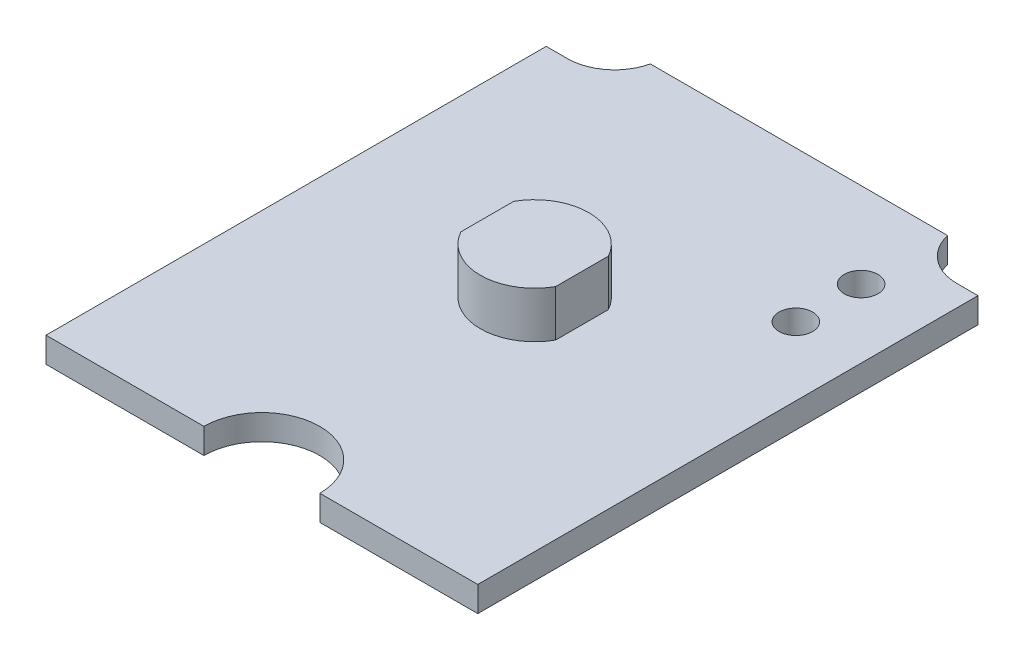
ISO-10303-21;
HEADER;
FILE_DESCRIPTION(('STEP AP214'),'2;1');
FILE_NAME('part.step','',(''),(''),'','','');
FILE_SCHEMA(('AUTOMOTIVE_DESIGN { 1 0 10303 214 1 1 1 1 }'));
ENDSEC;
DATA;
#1=APPLICATION_CONTEXT('core data for automotive mechanical design processes');
#2=APPLICATION_PROTOCOL_DEFINITION('international standard','automotive_design',2000,#1);
#3=PRODUCT_CONTEXT('',#1,'mechanical');
#4=PRODUCT('Part','Part','',(#3));
#5=PRODUCT_RELATED_PRODUCT_CATEGORY('part','',(#4));
#6=PRODUCT_DEFINITION_FORMATION('','',#4);
#7=PRODUCT_DEFINITION_CONTEXT('part definition',#1,'design');
#8=PRODUCT_DEFINITION('design','',#6,#7);
#9=PRODUCT_DEFINITION_SHAPE('','',#8);
#10=(LENGTH_UNIT() NAMED_UNIT(*) SI_UNIT(.MILLI.,.METRE.));
#11=(NAMED_UNIT(*) PLANE_ANGLE_UNIT() SI_UNIT($,.RADIAN.));
#12=(NAMED_UNIT(*) SI_UNIT($,.STERADIAN.) SOLID_ANGLE_UNIT());
#13=UNCERTAINTY_MEASURE_WITH_UNIT(LENGTH_MEASURE(1.E-05),#10,'distance_accuracy_value','');
#14=(GEOMETRIC_REPRESENTATION_CONTEXT(3) GLOBAL_UNCERTAINTY_ASSIGNED_CONTEXT((#13)) GLOBAL_UNIT_ASSIGNED_CONTEXT((#10,
#11,#12)) REPRESENTATION_CONTEXT('',''));
#15=CARTESIAN_POINT('',(0.,0.,0.));
#16=DIRECTION('',(0.,0.,1.));
#17=DIRECTION('',(1.,0.,0.));
#18=AXIS2_PLACEMENT_3D('',#15,#16,#17);
#19=CARTESIAN_POINT('',(0.,2.2,0.));
#20=DIRECTION('',(0.,1.,0.));
#21=DIRECTION('',(0.,0.,1.));
#22=AXIS2_PLACEMENT_3D('',#19,#20,#21);
#23=PLANE('',#22);
#24=CARTESIAN_POINT('',(0.,2.2,0.));
#25=DIRECTION('',(0.,1.,0.));
#26=DIRECTION('',(0.,0.,1.));
#27=AXIS2_PLACEMENT_3D('',#24,#25,#26);
#28=CIRCLE('',#27,2.575);
#29=CARTESIAN_POINT('',(2.25,2.2,1.25224797863686));
#30=VERTEX_POINT('',#29);
#31=CARTESIAN_POINT('',(-2.24999999999998,2.2,1.25224797863685));
#32=VERTEX_POINT('',#31);
#33=EDGE_CURVE('E139',#30,#32,#28,.F.);
#34=ORIENTED_EDGE('',*,*,#33,.F.);
#35=DIRECTION('',(0.,0.,-1.));
#36=VECTOR('',#35,1.);
#37=CARTESIAN_POINT('',(2.25,2.2,1.252247978637));
#38=LINE('',#37,#36);
#39=CARTESIAN_POINT('',(2.24999999999998,2.2,-1.25224797863685));
#40=VERTEX_POINT('',#39);
#41=EDGE_CURVE('E136',#40,#30,#38,.F.);
#42=ORIENTED_EDGE('',*,*,#41,.F.);
#43=CARTESIAN_POINT('',(0.,2.2,0.));
#44=DIRECTION('',(0.,1.,0.));
#45=DIRECTION('',(0.,0.,1.));
#46=AXIS2_PLACEMENT_3D('',#43,#44,#45);
#47=CIRCLE('',#46,2.575);
#48=CARTESIAN_POINT('',(-2.25,2.2,-1.25224797863686));
#49=VERTEX_POINT('',#48);
#50=EDGE_CURVE('E19',#49,#40,#47,.F.);
#51=ORIENTED_EDGE('',*,*,#50,.F.);
#52=DIRECTION('',(0.,0.,1.));
#53=VECTOR('',#52,1.);
#54=CARTESIAN_POINT('',(-2.25,2.2,-1.252247978637));
#55=LINE('',#54,#53);
#56=EDGE_CURVE('E141',#32,#49,#55,.F.);
#57=ORIENTED_EDGE('',*,*,#56,.F.);
#58=EDGE_LOOP('',(#34,#42,#51,#57));
#59=FACE_BOUND('',#58,.T.);
#60=ADVANCED_FACE('F16',(#59),#23,.T.);
#61=CARTESIAN_POINT('',(0.,-3.2,0.));
#62=DIRECTION('',(0.,-1.,0.));
#63=DIRECTION('',(0.,0.,-1.));
#64=AXIS2_PLACEMENT_3D('',#61,#62,#63);
#65=PLANE('',#64);
#66=DIRECTION('',(1.,0.,0.));
#67=VECTOR('',#66,1.);
#68=CARTESIAN_POINT('',(-3.,-3.2,5.5));
#69=LINE('',#68,#67);
#70=CARTESIAN_POINT('',(-9.,-3.2,5.5));
#71=VERTEX_POINT('',#70);
#72=CARTESIAN_POINT('',(-3.,-3.2,5.5));
#73=VERTEX_POINT('',#72);
#74=EDGE_CURVE('E260',#71,#73,#69,.T.);
#75=ORIENTED_EDGE('',*,*,#74,.F.);
#76=DIRECTION('',(0.,0.,1.));
#77=VECTOR('',#76,1.);
#78=CARTESIAN_POINT('',(-9.,-3.2,5.5));
#79=LINE('',#78,#77);
#80=CARTESIAN_POINT('',(-9.,-3.2,-3.2));
#81=VERTEX_POINT('',#80);
#82=EDGE_CURVE('E234',#81,#71,#79,.T.);
#83=ORIENTED_EDGE('',*,*,#82,.F.);
#84=DIRECTION('',(-1.,0.,0.));
#85=VECTOR('',#84,1.);
#86=CARTESIAN_POINT('',(-9.,-3.2,-3.2));
#87=LINE('',#86,#85);
#88=CARTESIAN_POINT('',(-3.,-3.2,-3.2));
#89=VERTEX_POINT('',#88);
#90=EDGE_CURVE('E250',#89,#81,#87,.T.);
#91=ORIENTED_EDGE('',*,*,#90,.F.);
#92=DIRECTION('',(0.,0.,-1.));
#93=VECTOR('',#92,1.);
#94=CARTESIAN_POINT('',(-3.,-3.2,-3.2));
#95=LINE('',#94,#93);
#96=EDGE_CURVE('E255',#73,#89,#95,.T.);
#97=ORIENTED_EDGE('',*,*,#96,.F.);
#98=EDGE_LOOP('',(#75,#83,#91,#97));
#99=FACE_BOUND('',#98,.T.);
#100=ADVANCED_FACE('F485',(#99),#65,.T.);
#101=CARTESIAN_POINT('',(0.,-4.5,0.));
#102=DIRECTION('',(0.,1.,0.));
#103=DIRECTION('',(0.,0.,1.));
#104=AXIS2_PLACEMENT_3D('',#101,#102,#103);
#105=PLANE('',#104);
#106=CARTESIAN_POINT('',(0.,-4.5,1.75));
#107=DIRECTION('',(0.,1.,0.));
#108=DIRECTION('',(0.,0.,1.));
#109=AXIS2_PLACEMENT_3D('',#106,#107,#108);
#110=CIRCLE('',#109,0.25);
#111=CARTESIAN_POINT('',(0.,-4.5,2.));
#112=VERTEX_POINT('',#111);
#113=EDGE_CURVE('E232',#112,#112,#110,.T.);
#114=ORIENTED_EDGE('',*,*,#113,.F.);
#115=EDGE_LOOP('',(#114));
#116=FACE_BOUND('',#115,.T.);
#117=ADVANCED_FACE('F482',(#116),#105,.F.);
#118=CARTESIAN_POINT('',(0.,-4.5,0.));
#119=DIRECTION('',(0.,1.,0.));
#120=DIRECTION('',(0.,0.,1.));
#121=AXIS2_PLACEMENT_3D('',#118,#119,#120);
#122=PLANE('',#121);
#123=CARTESIAN_POINT('',(0.,-4.5,-1.75));
#124=DIRECTION('',(0.,1.,0.));
#125=DIRECTION('',(0.,0.,1.));
#126=AXIS2_PLACEMENT_3D('',#123,#124,#125);
#127=CIRCLE('',#126,0.25);
#128=CARTESIAN_POINT('',(0.,-4.5,-1.5));
#129=VERTEX_POINT('',#128);
#130=EDGE_CURVE('E229',#129,#129,#127,.T.);
#131=ORIENTED_EDGE('',*,*,#130,.F.);
#132=EDGE_LOOP('',(#131));
#133=FACE_BOUND('',#132,.T.);
#134=ADVANCED_FACE('F479',(#133),#122,.F.);
#135=CARTESIAN_POINT('',(2.25,0.,1.252247978637));
#136=DIRECTION('',(1.,0.,0.));
#137=DIRECTION('',(0.,0.,-1.));
#138=AXIS2_PLACEMENT_3D('',#135,#136,#137);
#139=PLANE('',#138);
#140=DIRECTION('',(0.,1.,0.));
#141=VECTOR('',#140,1.);
#142=CARTESIAN_POINT('',(2.24999999999996,0.,-1.25224797863689));
#143=LINE('',#142,#141);
#144=CARTESIAN_POINT('',(2.24999999999998,0.,-1.25224797863685));
#145=VERTEX_POINT('',#144);
#146=EDGE_CURVE('E153',#40,#145,#143,.F.);
#147=ORIENTED_EDGE('',*,*,#146,.F.);
#148=ORIENTED_EDGE('',*,*,#41,.T.);
#149=DIRECTION('',(0.,1.,0.));
#150=VECTOR('',#149,1.);
#151=CARTESIAN_POINT('',(2.25,0.,1.25224797863691));
#152=LINE('',#151,#150);
#153=CARTESIAN_POINT('',(2.25,0.,1.25224797863686));
#154=VERTEX_POINT('',#153);
#155=EDGE_CURVE('E151',#30,#154,#152,.F.);
#156=ORIENTED_EDGE('',*,*,#155,.T.);
#157=DIRECTION('',(0.,0.,1.));
#158=VECTOR('',#157,1.);
#159=CARTESIAN_POINT('',(2.25,0.,0.));
#160=LINE('',#159,#158);
#161=EDGE_CURVE('E228',#154,#145,#160,.F.);
#162=ORIENTED_EDGE('',*,*,#161,.T.);
#163=EDGE_LOOP('',(#147,#148,#156,#162));
#164=FACE_BOUND('',#163,.T.);
#165=ADVANCED_FACE('F149',(#164),#139,.T.);
#166=CARTESIAN_POINT('',(0.,0.,0.));
#167=DIRECTION('',(0.,1.,0.));
#168=DIRECTION('',(0.,0.,1.));
#169=AXIS2_PLACEMENT_3D('',#166,#167,#168);
#170=CYLINDRICAL_SURFACE('',#169,2.575);
#171=DIRECTION('',(0.,1.,0.));
#172=VECTOR('',#171,1.);
#173=CARTESIAN_POINT('',(-2.25,0.,-1.25224797863691));
#174=LINE('',#173,#172);
#175=CARTESIAN_POINT('',(-2.25,0.,-1.25224797863686));
#176=VERTEX_POINT('',#175);
#177=EDGE_CURVE('E162',#49,#176,#174,.F.);
#178=ORIENTED_EDGE('',*,*,#177,.F.);
#179=ORIENTED_EDGE('',*,*,#50,.T.);
#180=ORIENTED_EDGE('',*,*,#146,.T.);
#181=CARTESIAN_POINT('',(0.,0.,0.));
#182=DIRECTION('',(0.,1.,0.));
#183=DIRECTION('',(0.,0.,1.));
#184=AXIS2_PLACEMENT_3D('',#181,#182,#183);
#185=CIRCLE('',#184,2.575);
#186=EDGE_CURVE('E225',#145,#176,#185,.T.);
#187=ORIENTED_EDGE('',*,*,#186,.T.);
#188=EDGE_LOOP('',(#178,#179,#180,#187));
#189=FACE_BOUND('',#188,.T.);
#190=ADVANCED_FACE('F268',(#189),#170,.T.);
#191=CARTESIAN_POINT('',(-2.25,0.,-1.252247978637));
#192=DIRECTION('',(-1.,0.,0.));
#193=DIRECTION('',(0.,0.,1.));
#194=AXIS2_PLACEMENT_3D('',#191,#192,#193);
#195=PLANE('',#194);
#196=DIRECTION('',(0.,1.,0.));
#197=VECTOR('',#196,1.);
#198=CARTESIAN_POINT('',(-2.24999999999996,0.,1.25224797863689));
#199=LINE('',#198,#197);
#200=CARTESIAN_POINT('',(-2.24999999999998,0.,1.25224797863685));
#201=VERTEX_POINT('',#200);
#202=EDGE_CURVE('E145',#32,#201,#199,.F.);
#203=ORIENTED_EDGE('',*,*,#202,.F.);
#204=ORIENTED_EDGE('',*,*,#56,.T.);
#205=ORIENTED_EDGE('',*,*,#177,.T.);
#206=DIRECTION('',(0.,0.,1.));
#207=VECTOR('',#206,1.);
#208=CARTESIAN_POINT('',(-2.25,0.,0.));
#209=LINE('',#208,#207);
#210=EDGE_CURVE('E224',#176,#201,#209,.T.);
#211=ORIENTED_EDGE('',*,*,#210,.T.);
#212=EDGE_LOOP('',(#203,#204,#205,#211));
#213=FACE_BOUND('',#212,.T.);
#214=ADVANCED_FACE('F472',(#213),#195,.T.);
#215=CARTESIAN_POINT('',(0.,0.,0.));
#216=DIRECTION('',(0.,1.,0.));
#217=DIRECTION('',(0.,0.,1.));
#218=AXIS2_PLACEMENT_3D('',#215,#216,#217);
#219=CYLINDRICAL_SURFACE('',#218,2.575);
#220=ORIENTED_EDGE('',*,*,#33,.T.);
#221=ORIENTED_EDGE('',*,*,#202,.T.);
#222=CARTESIAN_POINT('',(0.,0.,0.));
#223=DIRECTION('',(0.,1.,0.));
#224=DIRECTION('',(0.,0.,1.));
#225=AXIS2_PLACEMENT_3D('',#222,#223,#224);
#226=CIRCLE('',#225,2.575);
#227=EDGE_CURVE('E157',#201,#154,#226,.T.);
#228=ORIENTED_EDGE('',*,*,#227,.T.);
#229=ORIENTED_EDGE('',*,*,#155,.F.);
#230=EDGE_LOOP('',(#220,#221,#228,#229));
#231=FACE_BOUND('',#230,.T.);
#232=ADVANCED_FACE('F155',(#231),#219,.T.);
#233=CARTESIAN_POINT('',(-3.,-1.4,5.5));
#234=DIRECTION('',(0.,0.,1.));
#235=DIRECTION('',(1.,0.,0.));
#236=AXIS2_PLACEMENT_3D('',#233,#234,#235);
#237=PLANE('',#236);
#238=DIRECTION('',(0.,1.,0.));
#239=VECTOR('',#238,1.);
#240=CARTESIAN_POINT('',(-9.,-1.4,5.5));
#241=LINE('',#240,#239);
#242=CARTESIAN_POINT('',(-9.,-1.4,5.5));
#243=VERTEX_POINT('',#242);
#244=EDGE_CURVE('E244',#71,#243,#241,.T.);
#245=ORIENTED_EDGE('',*,*,#244,.F.);
#246=ORIENTED_EDGE('',*,*,#74,.T.);
#247=DIRECTION('',(0.,1.,0.));
#248=VECTOR('',#247,1.);
#249=CARTESIAN_POINT('',(-3.,-1.4,5.5));
#250=LINE('',#249,#248);
#251=CARTESIAN_POINT('',(-3.,-1.4,5.5));
#252=VERTEX_POINT('',#251);
#253=EDGE_CURVE('E257',#252,#73,#250,.F.);
#254=ORIENTED_EDGE('',*,*,#253,.F.);
#255=DIRECTION('',(1.,0.,0.));
#256=VECTOR('',#255,1.);
#257=CARTESIAN_POINT('',(0.,-1.4,5.5));
#258=LINE('',#257,#256);
#259=EDGE_CURVE('E223',#243,#252,#258,.T.);
#260=ORIENTED_EDGE('',*,*,#259,.F.);
#261=EDGE_LOOP('',(#245,#246,#254,#260));
#262=FACE_BOUND('',#261,.T.);
#263=ADVANCED_FACE('F465',(#262),#237,.T.);
#264=CARTESIAN_POINT('',(-3.,-1.4,-3.2));
#265=DIRECTION('',(1.,0.,0.));
#266=DIRECTION('',(0.,0.,-1.));
#267=AXIS2_PLACEMENT_3D('',#264,#265,#266);
#268=PLANE('',#267);
#269=ORIENTED_EDGE('',*,*,#253,.T.);
#270=ORIENTED_EDGE('',*,*,#96,.T.);
#271=DIRECTION('',(0.,1.,0.));
#272=VECTOR('',#271,1.);
#273=CARTESIAN_POINT('',(-3.,-1.4,-3.2));
#274=LINE('',#273,#272);
#275=CARTESIAN_POINT('',(-3.,-1.4,-3.2));
#276=VERTEX_POINT('',#275);
#277=EDGE_CURVE('E252',#276,#89,#274,.F.);
#278=ORIENTED_EDGE('',*,*,#277,.F.);
#279=DIRECTION('',(0.,0.,-1.));
#280=VECTOR('',#279,1.);
#281=CARTESIAN_POINT('',(-3.,-1.4,0.));
#282=LINE('',#281,#280);
#283=EDGE_CURVE('E293',#252,#276,#282,.T.);
#284=ORIENTED_EDGE('',*,*,#283,.F.);
#285=EDGE_LOOP('',(#269,#270,#278,#284));
#286=FACE_BOUND('',#285,.T.);
#287=ADVANCED_FACE('F461',(#286),#268,.T.);
#288=CARTESIAN_POINT('',(-9.,-1.4,-3.2));
#289=DIRECTION('',(0.,0.,-1.));
#290=DIRECTION('',(-1.,0.,0.));
#291=AXIS2_PLACEMENT_3D('',#288,#289,#290);
#292=PLANE('',#291);
#293=ORIENTED_EDGE('',*,*,#277,.T.);
#294=ORIENTED_EDGE('',*,*,#90,.T.);
#295=DIRECTION('',(0.,1.,0.));
#296=VECTOR('',#295,1.);
#297=CARTESIAN_POINT('',(-9.,-1.4,-3.2));
#298=LINE('',#297,#296);
#299=CARTESIAN_POINT('',(-9.,-1.4,-3.2));
#300=VERTEX_POINT('',#299);
#301=EDGE_CURVE('E238',#300,#81,#298,.F.);
#302=ORIENTED_EDGE('',*,*,#301,.F.);
#303=DIRECTION('',(1.,0.,0.));
#304=VECTOR('',#303,1.);
#305=CARTESIAN_POINT('',(0.,-1.4,-3.2));
#306=LINE('',#305,#304);
#307=EDGE_CURVE('E295',#276,#300,#306,.F.);
#308=ORIENTED_EDGE('',*,*,#307,.F.);
#309=EDGE_LOOP('',(#293,#294,#302,#308));
#310=FACE_BOUND('',#309,.T.);
#311=ADVANCED_FACE('F458',(#310),#292,.T.);
#312=CARTESIAN_POINT('',(-9.,-1.4,5.5));
#313=DIRECTION('',(-1.,0.,0.));
#314=DIRECTION('',(0.,0.,1.));
#315=AXIS2_PLACEMENT_3D('',#312,#313,#314);
#316=PLANE('',#315);
#317=ORIENTED_EDGE('',*,*,#301,.T.);
#318=ORIENTED_EDGE('',*,*,#82,.T.);
#319=ORIENTED_EDGE('',*,*,#244,.T.);
#320=DIRECTION('',(0.,0.,-1.));
#321=VECTOR('',#320,1.);
#322=CARTESIAN_POINT('',(-9.,-1.4,0.));
#323=LINE('',#322,#321);
#324=EDGE_CURVE('E221',#300,#243,#323,.F.);
#325=ORIENTED_EDGE('',*,*,#324,.F.);
#326=EDGE_LOOP('',(#317,#318,#319,#325));
#327=FACE_BOUND('',#326,.T.);
#328=ADVANCED_FACE('F455',(#327),#316,.T.);
#329=CARTESIAN_POINT('',(0.,0.,1.75));
#330=DIRECTION('',(0.,1.,0.));
#331=DIRECTION('',(0.,0.,1.));
#332=AXIS2_PLACEMENT_3D('',#329,#330,#331);
#333=CYLINDRICAL_SURFACE('',#332,0.25);
#334=ORIENTED_EDGE('',*,*,#113,.T.);
#335=EDGE_LOOP('',(#334));
#336=FACE_BOUND('',#335,.T.);
#337=CARTESIAN_POINT('',(0.,-1.4,1.75));
#338=DIRECTION('',(0.,1.,0.));
#339=DIRECTION('',(0.,0.,1.));
#340=AXIS2_PLACEMENT_3D('',#337,#338,#339);
#341=CIRCLE('',#340,0.25);
#342=CARTESIAN_POINT('',(0.,-1.4,2.));
#343=VERTEX_POINT('',#342);
#344=EDGE_CURVE('E218',#343,#343,#341,.T.);
#345=ORIENTED_EDGE('',*,*,#344,.F.);
#346=EDGE_LOOP('',(#345));
#347=FACE_BOUND('',#346,.T.);
#348=ADVANCED_FACE('F451',(#336,#347),#333,.T.);
#349=CARTESIAN_POINT('',(0.,0.,-1.75));
#350=DIRECTION('',(0.,1.,0.));
#351=DIRECTION('',(0.,0.,1.));
#352=AXIS2_PLACEMENT_3D('',#349,#350,#351);
#353=CYLINDRICAL_SURFACE('',#352,0.25);
#354=ORIENTED_EDGE('',*,*,#130,.T.);
#355=EDGE_LOOP('',(#354));
#356=FACE_BOUND('',#355,.T.);
#357=CARTESIAN_POINT('',(0.,-1.4,-1.75));
#358=DIRECTION('',(0.,1.,0.));
#359=DIRECTION('',(0.,0.,1.));
#360=AXIS2_PLACEMENT_3D('',#357,#358,#359);
#361=CIRCLE('',#360,0.25);
#362=CARTESIAN_POINT('',(0.,-1.4,-1.5));
#363=VERTEX_POINT('',#362);
#364=EDGE_CURVE('E215',#363,#363,#361,.T.);
#365=ORIENTED_EDGE('',*,*,#364,.F.);
#366=EDGE_LOOP('',(#365));
#367=FACE_BOUND('',#366,.T.);
#368=ADVANCED_FACE('F448',(#356,#367),#353,.T.);
#369=CARTESIAN_POINT('',(0.,0.,0.));
#370=DIRECTION('',(0.,1.,0.));
#371=DIRECTION('',(0.,0.,1.));
#372=AXIS2_PLACEMENT_3D('',#369,#370,#371);
#373=PLANE('',#372);
#374=ORIENTED_EDGE('',*,*,#210,.F.);
#375=ORIENTED_EDGE('',*,*,#186,.F.);
#376=ORIENTED_EDGE('',*,*,#161,.F.);
#377=ORIENTED_EDGE('',*,*,#227,.F.);
#378=EDGE_LOOP('',(#374,#375,#376,#377));
#379=FACE_BOUND('',#378,.T.);
#380=CARTESIAN_POINT('',(0.,0.,-1.75));
#381=DIRECTION('',(0.,1.,0.));
#382=DIRECTION('',(0.,0.,1.));
#383=AXIS2_PLACEMENT_3D('',#380,#381,#382);
#384=CIRCLE('',#383,0.25);
#385=CARTESIAN_POINT('',(0.,0.,-1.5));
#386=VERTEX_POINT('',#385);
#387=EDGE_CURVE('E202',#386,#386,#384,.F.);
#388=ORIENTED_EDGE('',*,*,#387,.F.);
#389=EDGE_LOOP('',(#388));
#390=FACE_BOUND('',#389,.T.);
#391=CARTESIAN_POINT('',(0.,0.,1.75));
#392=DIRECTION('',(0.,1.,0.));
#393=DIRECTION('',(0.,0.,1.));
#394=AXIS2_PLACEMENT_3D('',#391,#392,#393);
#395=CIRCLE('',#394,0.25);
#396=CARTESIAN_POINT('',(0.,0.,2.));
#397=VERTEX_POINT('',#396);
#398=EDGE_CURVE('E206',#397,#397,#395,.F.);
#399=ORIENTED_EDGE('',*,*,#398,.F.);
#400=EDGE_LOOP('',(#399));
#401=FACE_BOUND('',#400,.T.);
#402=ADVANCED_FACE('F270',(#379,#390,#401),#373,.F.);
#403=CARTESIAN_POINT('',(0.,-1.4,0.));
#404=DIRECTION('',(0.,-1.,0.));
#405=DIRECTION('',(0.,0.,-1.));
#406=AXIS2_PLACEMENT_3D('',#403,#404,#405);
#407=PLANE('',#406);
#408=DIRECTION('',(1.,0.,0.));
#409=VECTOR('',#408,1.);
#410=CARTESIAN_POINT('',(9.25,-1.4,-10.8));
#411=LINE('',#410,#409);
#412=CARTESIAN_POINT('',(9.25,-1.4,-10.8));
#413=VERTEX_POINT('',#412);
#414=CARTESIAN_POINT('',(10.25,-1.4,-10.8));
#415=VERTEX_POINT('',#414);
#416=EDGE_CURVE('E301',#413,#415,#411,.T.);
#417=ORIENTED_EDGE('',*,*,#416,.T.);
#418=DIRECTION('',(0.,0.,-1.));
#419=VECTOR('',#418,1.);
#420=CARTESIAN_POINT('',(10.25,-1.4,-12.55));
#421=LINE('',#420,#419);
#422=CARTESIAN_POINT('',(10.25,-1.4,12.95));
#423=VERTEX_POINT('',#422);
#424=EDGE_CURVE('E304',#423,#415,#421,.T.);
#425=ORIENTED_EDGE('',*,*,#424,.F.);
#426=DIRECTION('',(1.,0.,0.));
#427=VECTOR('',#426,1.);
#428=CARTESIAN_POINT('',(10.25,-1.4,12.95));
#429=LINE('',#428,#427);
#430=CARTESIAN_POINT('',(2.75,-1.4,12.95));
#431=VERTEX_POINT('',#430);
#432=EDGE_CURVE('E205',#431,#423,#429,.T.);
#433=ORIENTED_EDGE('',*,*,#432,.F.);
#434=CARTESIAN_POINT('',(0.,-1.4,12.95));
#435=DIRECTION('',(0.,1.,0.));
#436=DIRECTION('',(0.,0.,1.));
#437=AXIS2_PLACEMENT_3D('',#434,#435,#436);
#438=CIRCLE('',#437,2.75);
#439=CARTESIAN_POINT('',(-2.75,-1.4,12.95));
#440=VERTEX_POINT('',#439);
#441=EDGE_CURVE('E198',#431,#440,#438,.T.);
#442=ORIENTED_EDGE('',*,*,#441,.T.);
#443=DIRECTION('',(1.,0.,0.));
#444=VECTOR('',#443,1.);
#445=CARTESIAN_POINT('',(10.25,-1.4,12.95));
#446=LINE('',#445,#444);
#447=CARTESIAN_POINT('',(-10.25,-1.4,12.95));
#448=VERTEX_POINT('',#447);
#449=EDGE_CURVE('E275',#448,#440,#446,.T.);
#450=ORIENTED_EDGE('',*,*,#449,.F.);
#451=DIRECTION('',(0.,0.,1.));
#452=VECTOR('',#451,1.);
#453=CARTESIAN_POINT('',(-10.25,-1.4,12.95));
#454=LINE('',#453,#452);
#455=CARTESIAN_POINT('',(-10.25,-1.4,-10.8));
#456=VERTEX_POINT('',#455);
#457=EDGE_CURVE('E281',#456,#448,#454,.T.);
#458=ORIENTED_EDGE('',*,*,#457,.F.);
#459=DIRECTION('',(1.,0.,0.));
#460=VECTOR('',#459,1.);
#461=CARTESIAN_POINT('',(-11.9165934075,-1.4,-10.8));
#462=LINE('',#461,#460);
#463=CARTESIAN_POINT('',(-9.25,-1.4,-10.8));
#464=VERTEX_POINT('',#463);
#465=EDGE_CURVE('E287',#456,#464,#462,.T.);
#466=ORIENTED_EDGE('',*,*,#465,.T.);
#467=CARTESIAN_POINT('',(-9.25,-1.4,-13.05));
#468=DIRECTION('',(0.,1.,0.));
#469=DIRECTION('',(0.,0.,1.));
#470=AXIS2_PLACEMENT_3D('',#467,#468,#469);
#471=CIRCLE('',#470,2.25);
#472=CARTESIAN_POINT('',(-7.05625890315198,-1.4,-12.55));
#473=VERTEX_POINT('',#472);
#474=EDGE_CURVE('E194',#464,#473,#471,.T.);
#475=ORIENTED_EDGE('',*,*,#474,.T.);
#476=DIRECTION('',(-1.,0.,0.));
#477=VECTOR('',#476,1.);
#478=CARTESIAN_POINT('',(-10.25,-1.4,-12.55));
#479=LINE('',#478,#477);
#480=CARTESIAN_POINT('',(7.05625890315197,-1.4,-12.55));
#481=VERTEX_POINT('',#480);
#482=EDGE_CURVE('E289',#481,#473,#479,.T.);
#483=ORIENTED_EDGE('',*,*,#482,.F.);
#484=CARTESIAN_POINT('',(9.25,-1.4,-13.05));
#485=DIRECTION('',(0.,1.,0.));
#486=DIRECTION('',(0.,0.,1.));
#487=AXIS2_PLACEMENT_3D('',#484,#485,#486);
#488=CIRCLE('',#487,2.25);
#489=EDGE_CURVE('E190',#481,#413,#488,.T.);
#490=ORIENTED_EDGE('',*,*,#489,.T.);
#491=EDGE_LOOP('',(#417,#425,#433,#442,#450,#458,#466,#475,#483,#490));
#492=FACE_BOUND('',#491,.T.);
#493=ORIENTED_EDGE('',*,*,#364,.T.);
#494=EDGE_LOOP('',(#493));
#495=FACE_BOUND('',#494,.T.);
#496=ORIENTED_EDGE('',*,*,#344,.T.);
#497=EDGE_LOOP('',(#496));
#498=FACE_BOUND('',#497,.T.);
#499=CARTESIAN_POINT('',(7.,-1.4,-8.5));
#500=DIRECTION('',(0.,1.,0.));
#501=DIRECTION('',(0.,0.,1.));
#502=AXIS2_PLACEMENT_3D('',#499,#500,#501);
#503=CIRCLE('',#502,0.8);
#504=CARTESIAN_POINT('',(7.,-1.4,-7.7));
#505=VERTEX_POINT('',#504);
#506=EDGE_CURVE('E209',#505,#505,#503,.T.);
#507=ORIENTED_EDGE('',*,*,#506,.T.);
#508=EDGE_LOOP('',(#507));
#509=FACE_BOUND('',#508,.T.);
#510=CARTESIAN_POINT('',(7.,-1.4,-5.4));
#511=DIRECTION('',(0.,1.,0.));
#512=DIRECTION('',(0.,0.,1.));
#513=AXIS2_PLACEMENT_3D('',#510,#511,#512);
#514=CIRCLE('',#513,0.8);
#515=CARTESIAN_POINT('',(7.,-1.4,-4.6));
#516=VERTEX_POINT('',#515);
#517=EDGE_CURVE('E212',#516,#516,#514,.T.);
#518=ORIENTED_EDGE('',*,*,#517,.T.);
#519=EDGE_LOOP('',(#518));
#520=FACE_BOUND('',#519,.T.);
#521=ORIENTED_EDGE('',*,*,#307,.T.);
#522=ORIENTED_EDGE('',*,*,#324,.T.);
#523=ORIENTED_EDGE('',*,*,#259,.T.);
#524=ORIENTED_EDGE('',*,*,#283,.T.);
#525=EDGE_LOOP('',(#521,#522,#523,#524));
#526=FACE_BOUND('',#525,.T.);
#527=ADVANCED_FACE('F441',(#492,#495,#498,#509,#520,#526),#407,.T.);
#528=CARTESIAN_POINT('',(7.,-0.2,-5.4));
#529=DIRECTION('',(0.,1.,0.));
#530=DIRECTION('',(0.,0.,1.));
#531=AXIS2_PLACEMENT_3D('',#528,#529,#530);
#532=CYLINDRICAL_SURFACE('',#531,0.8);
#533=ORIENTED_EDGE('',*,*,#517,.F.);
#534=EDGE_LOOP('',(#533));
#535=FACE_BOUND('',#534,.T.);
#536=CARTESIAN_POINT('',(7.,-0.2,-5.4));
#537=DIRECTION('',(0.,1.,0.));
#538=DIRECTION('',(0.,0.,1.));
#539=AXIS2_PLACEMENT_3D('',#536,#537,#538);
#540=CIRCLE('',#539,0.8);
#541=CARTESIAN_POINT('',(7.,-0.2,-4.6));
#542=VERTEX_POINT('',#541);
#543=EDGE_CURVE('E186',#542,#542,#540,.T.);
#544=ORIENTED_EDGE('',*,*,#543,.T.);
#545=EDGE_LOOP('',(#544));
#546=FACE_BOUND('',#545,.T.);
#547=ADVANCED_FACE('F437',(#535,#546),#532,.F.);
#548=CARTESIAN_POINT('',(7.,-0.2,-8.5));
#549=DIRECTION('',(0.,1.,0.));
#550=DIRECTION('',(0.,0.,1.));
#551=AXIS2_PLACEMENT_3D('',#548,#549,#550);
#552=CYLINDRICAL_SURFACE('',#551,0.8);
#553=ORIENTED_EDGE('',*,*,#506,.F.);
#554=EDGE_LOOP('',(#553));
#555=FACE_BOUND('',#554,.T.);
#556=CARTESIAN_POINT('',(7.,-0.2,-8.5));
#557=DIRECTION('',(0.,1.,0.));
#558=DIRECTION('',(0.,0.,1.));
#559=AXIS2_PLACEMENT_3D('',#556,#557,#558);
#560=CIRCLE('',#559,0.8);
#561=CARTESIAN_POINT('',(7.,-0.2,-7.7));
#562=VERTEX_POINT('',#561);
#563=EDGE_CURVE('E183',#562,#562,#560,.T.);
#564=ORIENTED_EDGE('',*,*,#563,.T.);
#565=EDGE_LOOP('',(#564));
#566=FACE_BOUND('',#565,.T.);
#567=ADVANCED_FACE('F433',(#555,#566),#552,.F.);
#568=CARTESIAN_POINT('',(0.,0.,1.75));
#569=DIRECTION('',(0.,1.,0.));
#570=DIRECTION('',(0.,0.,1.));
#571=AXIS2_PLACEMENT_3D('',#568,#569,#570);
#572=CYLINDRICAL_SURFACE('',#571,0.25);
#573=ORIENTED_EDGE('',*,*,#398,.T.);
#574=EDGE_LOOP('',(#573));
#575=FACE_BOUND('',#574,.T.);
#576=CARTESIAN_POINT('',(0.,-0.2,1.75));
#577=DIRECTION('',(0.,1.,0.));
#578=DIRECTION('',(0.,0.,1.));
#579=AXIS2_PLACEMENT_3D('',#576,#577,#578);
#580=CIRCLE('',#579,0.25);
#581=CARTESIAN_POINT('',(0.,-0.2,2.));
#582=VERTEX_POINT('',#581);
#583=EDGE_CURVE('E180',#582,#582,#580,.T.);
#584=ORIENTED_EDGE('',*,*,#583,.T.);
#585=EDGE_LOOP('',(#584));
#586=FACE_BOUND('',#585,.T.);
#587=ADVANCED_FACE('F429',(#575,#586),#572,.T.);
#588=CARTESIAN_POINT('',(0.,0.,-1.75));
#589=DIRECTION('',(0.,1.,0.));
#590=DIRECTION('',(0.,0.,1.));
#591=AXIS2_PLACEMENT_3D('',#588,#589,#590);
#592=CYLINDRICAL_SURFACE('',#591,0.25);
#593=ORIENTED_EDGE('',*,*,#387,.T.);
#594=EDGE_LOOP('',(#593));
#595=FACE_BOUND('',#594,.T.);
#596=CARTESIAN_POINT('',(0.,-0.2,-1.75));
#597=DIRECTION('',(0.,1.,0.));
#598=DIRECTION('',(0.,0.,1.));
#599=AXIS2_PLACEMENT_3D('',#596,#597,#598);
#600=CIRCLE('',#599,0.25);
#601=CARTESIAN_POINT('',(0.,-0.2,-1.5));
#602=VERTEX_POINT('',#601);
#603=EDGE_CURVE('E177',#602,#602,#600,.T.);
#604=ORIENTED_EDGE('',*,*,#603,.T.);
#605=EDGE_LOOP('',(#604));
#606=FACE_BOUND('',#605,.T.);
#607=ADVANCED_FACE('F426',(#595,#606),#592,.T.);
#608=CARTESIAN_POINT('',(10.25,-0.2,12.95));
#609=DIRECTION('',(0.,0.,1.));
#610=DIRECTION('',(1.,0.,0.));
#611=AXIS2_PLACEMENT_3D('',#608,#609,#610);
#612=PLANE('',#611);
#613=DIRECTION('',(0.,1.,0.));
#614=VECTOR('',#613,1.);
#615=CARTESIAN_POINT('',(2.75,-0.2,12.95));
#616=LINE('',#615,#614);
#617=CARTESIAN_POINT('',(2.75,-0.2,12.95));
#618=VERTEX_POINT('',#617);
#619=EDGE_CURVE('E201',#618,#431,#616,.F.);
#620=ORIENTED_EDGE('',*,*,#619,.T.);
#621=ORIENTED_EDGE('',*,*,#432,.T.);
#622=DIRECTION('',(0.,1.,0.));
#623=VECTOR('',#622,1.);
#624=CARTESIAN_POINT('',(10.25,-0.2,12.95));
#625=LINE('',#624,#623);
#626=CARTESIAN_POINT('',(10.25,-0.2,12.95));
#627=VERTEX_POINT('',#626);
#628=EDGE_CURVE('E189',#627,#423,#625,.F.);
#629=ORIENTED_EDGE('',*,*,#628,.F.);
#630=DIRECTION('',(1.,0.,0.));
#631=VECTOR('',#630,1.);
#632=CARTESIAN_POINT('',(0.,-0.2,12.95));
#633=LINE('',#632,#631);
#634=EDGE_CURVE('E176',#627,#618,#633,.F.);
#635=ORIENTED_EDGE('',*,*,#634,.T.);
#636=EDGE_LOOP('',(#620,#621,#629,#635));
#637=FACE_BOUND('',#636,.T.);
#638=ADVANCED_FACE('F396',(#637),#612,.T.);
#639=CARTESIAN_POINT('',(0.,-0.2,12.95));
#640=DIRECTION('',(0.,1.,0.));
#641=DIRECTION('',(0.,0.,1.));
#642=AXIS2_PLACEMENT_3D('',#639,#640,#641);
#643=CYLINDRICAL_SURFACE('',#642,2.75);
#644=DIRECTION('',(0.,1.,0.));
#645=VECTOR('',#644,1.);
#646=CARTESIAN_POINT('',(-2.75,-0.2,12.95));
#647=LINE('',#646,#645);
#648=CARTESIAN_POINT('',(-2.75,-0.2,12.95));
#649=VERTEX_POINT('',#648);
#650=EDGE_CURVE('E200',#440,#649,#647,.T.);
#651=ORIENTED_EDGE('',*,*,#650,.F.);
#652=ORIENTED_EDGE('',*,*,#441,.F.);
#653=ORIENTED_EDGE('',*,*,#619,.F.);
#654=CARTESIAN_POINT('',(0.,-0.2,12.95));
#655=DIRECTION('',(0.,1.,0.));
#656=DIRECTION('',(0.,0.,1.));
#657=AXIS2_PLACEMENT_3D('',#654,#655,#656);
#658=CIRCLE('',#657,2.75);
#659=EDGE_CURVE('E172',#618,#649,#658,.T.);
#660=ORIENTED_EDGE('',*,*,#659,.T.);
#661=EDGE_LOOP('',(#651,#652,#653,#660));
#662=FACE_BOUND('',#661,.T.);
#663=ADVANCED_FACE('F393',(#662),#643,.F.);
#664=CARTESIAN_POINT('',(10.25,-0.2,12.95));
#665=DIRECTION('',(0.,0.,1.));
#666=DIRECTION('',(1.,0.,0.));
#667=AXIS2_PLACEMENT_3D('',#664,#665,#666);
#668=PLANE('',#667);
#669=DIRECTION('',(0.,1.,0.));
#670=VECTOR('',#669,1.);
#671=CARTESIAN_POINT('',(-10.25,-0.2,12.95));
#672=LINE('',#671,#670);
#673=CARTESIAN_POINT('',(-10.25,-0.2,12.95));
#674=VERTEX_POINT('',#673);
#675=EDGE_CURVE('E278',#448,#674,#672,.T.);
#676=ORIENTED_EDGE('',*,*,#675,.F.);
#677=ORIENTED_EDGE('',*,*,#449,.T.);
#678=ORIENTED_EDGE('',*,*,#650,.T.);
#679=DIRECTION('',(1.,0.,0.));
#680=VECTOR('',#679,1.);
#681=CARTESIAN_POINT('',(0.,-0.2,12.95));
#682=LINE('',#681,#680);
#683=EDGE_CURVE('E175',#649,#674,#682,.F.);
#684=ORIENTED_EDGE('',*,*,#683,.T.);
#685=EDGE_LOOP('',(#676,#677,#678,#684));
#686=FACE_BOUND('',#685,.T.);
#687=ADVANCED_FACE('F389',(#686),#668,.T.);
#688=CARTESIAN_POINT('',(-10.25,-0.2,12.95));
#689=DIRECTION('',(-1.,0.,0.));
#690=DIRECTION('',(0.,0.,1.));
#691=AXIS2_PLACEMENT_3D('',#688,#689,#690);
#692=PLANE('',#691);
#693=DIRECTION('',(0.,1.,0.));
#694=VECTOR('',#693,1.);
#695=CARTESIAN_POINT('',(-10.25,-0.2,-10.8));
#696=LINE('',#695,#694);
#697=CARTESIAN_POINT('',(-10.25,-0.2,-10.8));
#698=VERTEX_POINT('',#697);
#699=EDGE_CURVE('E284',#698,#456,#696,.F.);
#700=ORIENTED_EDGE('',*,*,#699,.T.);
#701=ORIENTED_EDGE('',*,*,#457,.T.);
#702=ORIENTED_EDGE('',*,*,#675,.T.);
#703=DIRECTION('',(0.,0.,-1.));
#704=VECTOR('',#703,1.);
#705=CARTESIAN_POINT('',(-10.25,-0.2,0.));
#706=LINE('',#705,#704);
#707=EDGE_CURVE('E323',#674,#698,#706,.T.);
#708=ORIENTED_EDGE('',*,*,#707,.T.);
#709=EDGE_LOOP('',(#700,#701,#702,#708));
#710=FACE_BOUND('',#709,.T.);
#711=ADVANCED_FACE('F386',(#710),#692,.T.);
#712=CARTESIAN_POINT('',(-11.9165934075,-0.2,-10.8));
#713=DIRECTION('',(0.,0.,1.));
#714=DIRECTION('',(1.,0.,0.));
#715=AXIS2_PLACEMENT_3D('',#712,#713,#714);
#716=PLANE('',#715);
#717=ORIENTED_EDGE('',*,*,#699,.F.);
#718=DIRECTION('',(1.,0.,0.));
#719=VECTOR('',#718,1.);
#720=CARTESIAN_POINT('',(0.,-0.2,-10.8));
#721=LINE('',#720,#719);
#722=CARTESIAN_POINT('',(-9.25,-0.2,-10.8));
#723=VERTEX_POINT('',#722);
#724=EDGE_CURVE('E171',#698,#723,#721,.T.);
#725=ORIENTED_EDGE('',*,*,#724,.T.);
#726=DIRECTION('',(0.,1.,0.));
#727=VECTOR('',#726,1.);
#728=CARTESIAN_POINT('',(-9.25,-0.2,-10.8));
#729=LINE('',#728,#727);
#730=EDGE_CURVE('E197',#723,#464,#729,.F.);
#731=ORIENTED_EDGE('',*,*,#730,.T.);
#732=ORIENTED_EDGE('',*,*,#465,.F.);
#733=EDGE_LOOP('',(#717,#725,#731,#732));
#734=FACE_BOUND('',#733,.T.);
#735=ADVANCED_FACE('F382',(#734),#716,.F.);
#736=CARTESIAN_POINT('',(-9.25,-0.2,-13.05));
#737=DIRECTION('',(0.,1.,0.));
#738=DIRECTION('',(0.,0.,1.));
#739=AXIS2_PLACEMENT_3D('',#736,#737,#738);
#740=CYLINDRICAL_SURFACE('',#739,2.25);
#741=ORIENTED_EDGE('',*,*,#730,.F.);
#742=CARTESIAN_POINT('',(-9.25,-0.2,-13.05));
#743=DIRECTION('',(0.,1.,0.));
#744=DIRECTION('',(0.,0.,1.));
#745=AXIS2_PLACEMENT_3D('',#742,#743,#744);
#746=CIRCLE('',#745,2.25);
#747=CARTESIAN_POINT('',(-7.05625890315198,-0.2,-12.55));
#748=VERTEX_POINT('',#747);
#749=EDGE_CURVE('E168',#723,#748,#746,.T.);
#750=ORIENTED_EDGE('',*,*,#749,.T.);
#751=DIRECTION('',(0.,1.,0.));
#752=VECTOR('',#751,1.);
#753=CARTESIAN_POINT('',(-7.05625890315198,-0.2,-12.55));
#754=LINE('',#753,#752);
#755=EDGE_CURVE('E196',#473,#748,#754,.T.);
#756=ORIENTED_EDGE('',*,*,#755,.F.);
#757=ORIENTED_EDGE('',*,*,#474,.F.);
#758=EDGE_LOOP('',(#741,#750,#756,#757));
#759=FACE_BOUND('',#758,.T.);
#760=ADVANCED_FACE('F378',(#759),#740,.F.);
#761=CARTESIAN_POINT('',(-10.25,-0.2,-12.55));
#762=DIRECTION('',(0.,0.,-1.));
#763=DIRECTION('',(-1.,0.,0.));
#764=AXIS2_PLACEMENT_3D('',#761,#762,#763);
#765=PLANE('',#764);
#766=DIRECTION('',(0.,1.,0.));
#767=VECTOR('',#766,1.);
#768=CARTESIAN_POINT('',(7.05625890315197,-0.2,-12.55));
#769=LINE('',#768,#767);
#770=CARTESIAN_POINT('',(7.05625890315197,-0.2,-12.55));
#771=VERTEX_POINT('',#770);
#772=EDGE_CURVE('E193',#771,#481,#769,.F.);
#773=ORIENTED_EDGE('',*,*,#772,.T.);
#774=ORIENTED_EDGE('',*,*,#482,.T.);
#775=ORIENTED_EDGE('',*,*,#755,.T.);
#776=DIRECTION('',(1.,0.,0.));
#777=VECTOR('',#776,1.);
#778=CARTESIAN_POINT('',(0.,-0.2,-12.55));
#779=LINE('',#778,#777);
#780=EDGE_CURVE('E167',#748,#771,#779,.T.);
#781=ORIENTED_EDGE('',*,*,#780,.T.);
#782=EDGE_LOOP('',(#773,#774,#775,#781));
#783=FACE_BOUND('',#782,.T.);
#784=ADVANCED_FACE('F373',(#783),#765,.T.);
#785=CARTESIAN_POINT('',(9.25,-0.2,-13.05));
#786=DIRECTION('',(0.,1.,0.));
#787=DIRECTION('',(0.,0.,1.));
#788=AXIS2_PLACEMENT_3D('',#785,#786,#787);
#789=CYLINDRICAL_SURFACE('',#788,2.25);
#790=ORIENTED_EDGE('',*,*,#772,.F.);
#791=CARTESIAN_POINT('',(9.25,-0.2,-13.05));
#792=DIRECTION('',(0.,1.,0.));
#793=DIRECTION('',(0.,0.,1.));
#794=AXIS2_PLACEMENT_3D('',#791,#792,#793);
#795=CIRCLE('',#794,2.25);
#796=CARTESIAN_POINT('',(9.25,-0.2,-10.8));
#797=VERTEX_POINT('',#796);
#798=EDGE_CURVE('E164',#771,#797,#795,.T.);
#799=ORIENTED_EDGE('',*,*,#798,.T.);
#800=DIRECTION('',(0.,1.,0.));
#801=VECTOR('',#800,1.);
#802=CARTESIAN_POINT('',(9.25,-0.2,-10.8));
#803=LINE('',#802,#801);
#804=EDGE_CURVE('E192',#797,#413,#803,.F.);
#805=ORIENTED_EDGE('',*,*,#804,.T.);
#806=ORIENTED_EDGE('',*,*,#489,.F.);
#807=EDGE_LOOP('',(#790,#799,#805,#806));
#808=FACE_BOUND('',#807,.T.);
#809=ADVANCED_FACE('F370',(#808),#789,.F.);
#810=CARTESIAN_POINT('',(9.25,-0.2,-10.8));
#811=DIRECTION('',(0.,0.,1.));
#812=DIRECTION('',(1.,0.,0.));
#813=AXIS2_PLACEMENT_3D('',#810,#811,#812);
#814=PLANE('',#813);
#815=ORIENTED_EDGE('',*,*,#804,.F.);
#816=DIRECTION('',(1.,0.,0.));
#817=VECTOR('',#816,1.);
#818=CARTESIAN_POINT('',(0.,-0.2,-10.8));
#819=LINE('',#818,#817);
#820=CARTESIAN_POINT('',(10.25,-0.2,-10.8));
#821=VERTEX_POINT('',#820);
#822=EDGE_CURVE('E25',#797,#821,#819,.T.);
#823=ORIENTED_EDGE('',*,*,#822,.T.);
#824=DIRECTION('',(0.,1.,0.));
#825=VECTOR('',#824,1.);
#826=CARTESIAN_POINT('',(10.25,-0.2,-10.8));
#827=LINE('',#826,#825);
#828=EDGE_CURVE('E33',#415,#821,#827,.T.);
#829=ORIENTED_EDGE('',*,*,#828,.F.);
#830=ORIENTED_EDGE('',*,*,#416,.F.);
#831=EDGE_LOOP('',(#815,#823,#829,#830));
#832=FACE_BOUND('',#831,.T.);
#833=ADVANCED_FACE('F361',(#832),#814,.F.);
#834=CARTESIAN_POINT('',(10.25,-0.2,-12.55));
#835=DIRECTION('',(1.,0.,0.));
#836=DIRECTION('',(0.,0.,-1.));
#837=AXIS2_PLACEMENT_3D('',#834,#835,#836);
#838=PLANE('',#837);
#839=DIRECTION('',(0.,0.,-1.));
#840=VECTOR('',#839,1.);
#841=CARTESIAN_POINT('',(10.25,-0.2,0.));
#842=LINE('',#841,#840);
#843=EDGE_CURVE('E10',#821,#627,#842,.F.);
#844=ORIENTED_EDGE('',*,*,#843,.T.);
#845=ORIENTED_EDGE('',*,*,#628,.T.);
#846=ORIENTED_EDGE('',*,*,#424,.T.);
#847=ORIENTED_EDGE('',*,*,#828,.T.);
#848=EDGE_LOOP('',(#844,#845,#846,#847));
#849=FACE_BOUND('',#848,.T.);
#850=ADVANCED_FACE('F399',(#849),#838,.T.);
#851=CARTESIAN_POINT('',(0.,-0.2,0.));
#852=DIRECTION('',(0.,-1.,0.));
#853=DIRECTION('',(0.,0.,-1.));
#854=AXIS2_PLACEMENT_3D('',#851,#852,#853);
#855=PLANE('',#854);
#856=ORIENTED_EDGE('',*,*,#822,.F.);
#857=ORIENTED_EDGE('',*,*,#798,.F.);
#858=ORIENTED_EDGE('',*,*,#780,.F.);
#859=ORIENTED_EDGE('',*,*,#749,.F.);
#860=ORIENTED_EDGE('',*,*,#724,.F.);
#861=ORIENTED_EDGE('',*,*,#707,.F.);
#862=ORIENTED_EDGE('',*,*,#683,.F.);
#863=ORIENTED_EDGE('',*,*,#659,.F.);
#864=ORIENTED_EDGE('',*,*,#634,.F.);
#865=ORIENTED_EDGE('',*,*,#843,.F.);
#866=EDGE_LOOP('',(#856,#857,#858,#859,#860,#861,#862,#863,#864,#865));
#867=FACE_BOUND('',#866,.T.);
#868=ORIENTED_EDGE('',*,*,#603,.F.);
#869=EDGE_LOOP('',(#868));
#870=FACE_BOUND('',#869,.T.);
#871=ORIENTED_EDGE('',*,*,#583,.F.);
#872=EDGE_LOOP('',(#871));
#873=FACE_BOUND('',#872,.T.);
#874=ORIENTED_EDGE('',*,*,#563,.F.);
#875=EDGE_LOOP('',(#874));
#876=FACE_BOUND('',#875,.T.);
#877=ORIENTED_EDGE('',*,*,#543,.F.);
#878=EDGE_LOOP('',(#877));
#879=FACE_BOUND('',#878,.T.);
#880=ADVANCED_FACE('F365',(#867,#870,#873,#876,#879),#855,.F.);
#881=CLOSED_SHELL('',(#60,#100,#117,#134,#165,#190,#214,#232,#263,#287,#311,#328,#348,#368,#402,
#527,#547,#567,#587,#607,#638,#663,#687,#711,#735,#760,#784,#809,#833,#850,#880));
#882=MANIFOLD_SOLID_BREP('B1',#881);
#883=ADVANCED_BREP_SHAPE_REPRESENTATION('',(#18,#882),#14);
#884=SHAPE_DEFINITION_REPRESENTATION(#9,#883);
ENDSEC;
END-ISO-10303-21;
